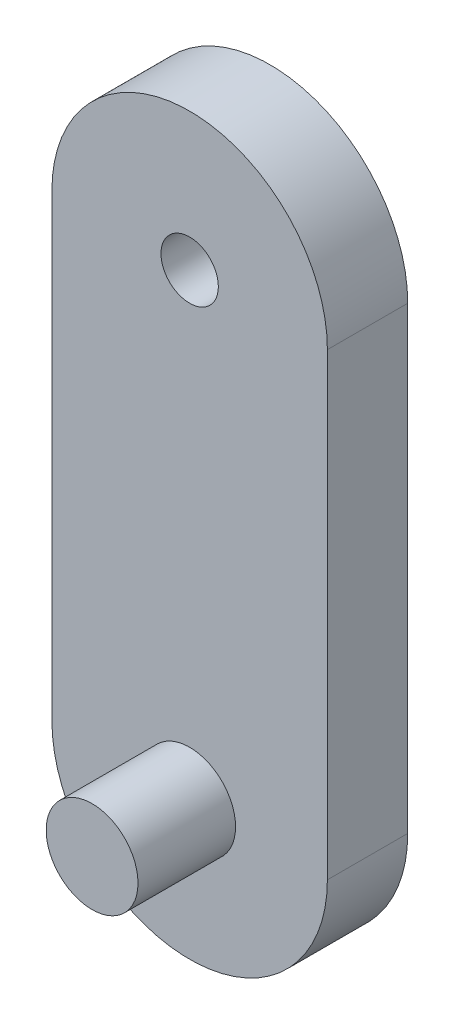
ISO-10303-21;
HEADER;
FILE_DESCRIPTION(('STEP AP214'),'2;1');
FILE_NAME('part.step','',(''),(''),'','','');
FILE_SCHEMA(('AUTOMOTIVE_DESIGN { 1 0 10303 214 1 1 1 1 }'));
ENDSEC;
DATA;
#1=APPLICATION_CONTEXT('core data for automotive mechanical design processes');
#2=APPLICATION_PROTOCOL_DEFINITION('international standard','automotive_design',2000,#1);
#3=PRODUCT_CONTEXT('',#1,'mechanical');
#4=PRODUCT('Part','Part','',(#3));
#5=PRODUCT_RELATED_PRODUCT_CATEGORY('part','',(#4));
#6=PRODUCT_DEFINITION_FORMATION('','',#4);
#7=PRODUCT_DEFINITION_CONTEXT('part definition',#1,'design');
#8=PRODUCT_DEFINITION('design','',#6,#7);
#9=PRODUCT_DEFINITION_SHAPE('','',#8);
#10=(LENGTH_UNIT() NAMED_UNIT(*) SI_UNIT(.MILLI.,.METRE.));
#11=(NAMED_UNIT(*) PLANE_ANGLE_UNIT() SI_UNIT($,.RADIAN.));
#12=(NAMED_UNIT(*) SI_UNIT($,.STERADIAN.) SOLID_ANGLE_UNIT());
#13=UNCERTAINTY_MEASURE_WITH_UNIT(LENGTH_MEASURE(1.E-05),#10,'distance_accuracy_value','');
#14=(GEOMETRIC_REPRESENTATION_CONTEXT(3) GLOBAL_UNCERTAINTY_ASSIGNED_CONTEXT((#13)) GLOBAL_UNIT_ASSIGNED_CONTEXT((#10,
#11,#12)) REPRESENTATION_CONTEXT('',''));
#15=CARTESIAN_POINT('',(0.,0.,0.));
#16=DIRECTION('',(0.,0.,1.));
#17=DIRECTION('',(1.,0.,0.));
#18=AXIS2_PLACEMENT_3D('',#15,#16,#17);
#19=CARTESIAN_POINT('',(-12.,0.,7.));
#20=DIRECTION('',(0.,0.,-1.));
#21=DIRECTION('',(-1.,0.,0.));
#22=AXIS2_PLACEMENT_3D('',#19,#20,#21);
#23=CYLINDRICAL_SURFACE('',#22,12.);
#24=CARTESIAN_POINT('',(-12.,0.,0.));
#25=DIRECTION('',(0.,0.,1.));
#26=DIRECTION('',(1.,0.,0.));
#27=AXIS2_PLACEMENT_3D('',#24,#25,#26);
#28=CIRCLE('',#27,12.);
#29=CARTESIAN_POINT('',(-24.,0.,0.));
#30=VERTEX_POINT('',#29);
#31=CARTESIAN_POINT('',(0.,0.,0.));
#32=VERTEX_POINT('',#31);
#33=EDGE_CURVE('E102',#30,#32,#28,.T.);
#34=ORIENTED_EDGE('',*,*,#33,.T.);
#35=DIRECTION('',(0.,0.,-1.));
#36=VECTOR('',#35,1.);
#37=CARTESIAN_POINT('',(0.,0.,7.));
#38=LINE('',#37,#36);
#39=CARTESIAN_POINT('',(0.,0.,7.));
#40=VERTEX_POINT('',#39);
#41=EDGE_CURVE('E11',#40,#32,#38,.T.);
#42=ORIENTED_EDGE('',*,*,#41,.F.);
#43=CARTESIAN_POINT('',(-12.,0.,7.));
#44=DIRECTION('',(0.,0.,1.));
#45=DIRECTION('',(1.,0.,0.));
#46=AXIS2_PLACEMENT_3D('',#43,#44,#45);
#47=CIRCLE('',#46,12.);
#48=CARTESIAN_POINT('',(-24.,0.,7.));
#49=VERTEX_POINT('',#48);
#50=EDGE_CURVE('E89',#49,#40,#47,.T.);
#51=ORIENTED_EDGE('',*,*,#50,.F.);
#52=DIRECTION('',(0.,0.,-1.));
#53=VECTOR('',#52,1.);
#54=CARTESIAN_POINT('',(-24.,0.,7.));
#55=LINE('',#54,#53);
#56=EDGE_CURVE('E98',#49,#30,#55,.T.);
#57=ORIENTED_EDGE('',*,*,#56,.T.);
#58=EDGE_LOOP('',(#34,#42,#51,#57));
#59=FACE_BOUND('',#58,.T.);
#60=ADVANCED_FACE('F37',(#59),#23,.T.);
#61=CARTESIAN_POINT('',(0.,0.,7.));
#62=DIRECTION('',(-1.,0.,0.));
#63=DIRECTION('',(0.,0.,1.));
#64=AXIS2_PLACEMENT_3D('',#61,#62,#63);
#65=PLANE('',#64);
#66=DIRECTION('',(0.,1.,0.));
#67=VECTOR('',#66,1.);
#68=CARTESIAN_POINT('',(0.,0.,0.));
#69=LINE('',#68,#67);
#70=CARTESIAN_POINT('',(0.,40.,0.));
#71=VERTEX_POINT('',#70);
#72=EDGE_CURVE('E93',#32,#71,#69,.T.);
#73=ORIENTED_EDGE('',*,*,#72,.T.);
#74=DIRECTION('',(0.,0.,-1.));
#75=VECTOR('',#74,1.);
#76=CARTESIAN_POINT('',(0.,40.,7.));
#77=LINE('',#76,#75);
#78=CARTESIAN_POINT('',(0.,40.,7.));
#79=VERTEX_POINT('',#78);
#80=EDGE_CURVE('E46',#79,#71,#77,.T.);
#81=ORIENTED_EDGE('',*,*,#80,.F.);
#82=DIRECTION('',(0.,1.,0.));
#83=VECTOR('',#82,1.);
#84=CARTESIAN_POINT('',(0.,0.,7.));
#85=LINE('',#84,#83);
#86=EDGE_CURVE('E84',#40,#79,#85,.T.);
#87=ORIENTED_EDGE('',*,*,#86,.F.);
#88=ORIENTED_EDGE('',*,*,#41,.T.);
#89=EDGE_LOOP('',(#73,#81,#87,#88));
#90=FACE_BOUND('',#89,.T.);
#91=ADVANCED_FACE('F92',(#90),#65,.F.);
#92=CARTESIAN_POINT('',(-12.,40.,7.));
#93=DIRECTION('',(0.,0.,-1.));
#94=DIRECTION('',(-1.,0.,0.));
#95=AXIS2_PLACEMENT_3D('',#92,#93,#94);
#96=CYLINDRICAL_SURFACE('',#95,12.);
#97=CARTESIAN_POINT('',(-12.,40.,0.));
#98=DIRECTION('',(0.,0.,1.));
#99=DIRECTION('',(-1.,0.,0.));
#100=AXIS2_PLACEMENT_3D('',#97,#98,#99);
#101=CIRCLE('',#100,12.);
#102=CARTESIAN_POINT('',(-24.,40.,0.));
#103=VERTEX_POINT('',#102);
#104=EDGE_CURVE('E71',#71,#103,#101,.T.);
#105=ORIENTED_EDGE('',*,*,#104,.T.);
#106=DIRECTION('',(0.,0.,-1.));
#107=VECTOR('',#106,1.);
#108=CARTESIAN_POINT('',(-24.,40.,7.));
#109=LINE('',#108,#107);
#110=CARTESIAN_POINT('',(-24.,40.,7.));
#111=VERTEX_POINT('',#110);
#112=EDGE_CURVE('E94',#111,#103,#109,.T.);
#113=ORIENTED_EDGE('',*,*,#112,.F.);
#114=CARTESIAN_POINT('',(-12.,40.,7.));
#115=DIRECTION('',(0.,0.,1.));
#116=DIRECTION('',(-1.,0.,0.));
#117=AXIS2_PLACEMENT_3D('',#114,#115,#116);
#118=CIRCLE('',#117,12.);
#119=EDGE_CURVE('E87',#79,#111,#118,.T.);
#120=ORIENTED_EDGE('',*,*,#119,.F.);
#121=ORIENTED_EDGE('',*,*,#80,.T.);
#122=EDGE_LOOP('',(#105,#113,#120,#121));
#123=FACE_BOUND('',#122,.T.);
#124=ADVANCED_FACE('F96',(#123),#96,.T.);
#125=CARTESIAN_POINT('',(-24.,0.,7.));
#126=DIRECTION('',(1.,0.,0.));
#127=DIRECTION('',(0.,0.,-1.));
#128=AXIS2_PLACEMENT_3D('',#125,#126,#127);
#129=PLANE('',#128);
#130=DIRECTION('',(0.,-1.,0.));
#131=VECTOR('',#130,1.);
#132=CARTESIAN_POINT('',(-24.,0.,0.));
#133=LINE('',#132,#131);
#134=EDGE_CURVE('E77',#103,#30,#133,.T.);
#135=ORIENTED_EDGE('',*,*,#134,.T.);
#136=ORIENTED_EDGE('',*,*,#56,.F.);
#137=DIRECTION('',(0.,-1.,0.));
#138=VECTOR('',#137,1.);
#139=CARTESIAN_POINT('',(-24.,0.,7.));
#140=LINE('',#139,#138);
#141=EDGE_CURVE('E54',#111,#49,#140,.T.);
#142=ORIENTED_EDGE('',*,*,#141,.F.);
#143=ORIENTED_EDGE('',*,*,#112,.T.);
#144=EDGE_LOOP('',(#135,#136,#142,#143));
#145=FACE_BOUND('',#144,.T.);
#146=ADVANCED_FACE('F110',(#145),#129,.F.);
#147=CARTESIAN_POINT('',(-12.,0.,7.));
#148=DIRECTION('',(0.,0.,1.));
#149=DIRECTION('',(1.,0.,0.));
#150=AXIS2_PLACEMENT_3D('',#147,#148,#149);
#151=PLANE('',#150);
#152=CARTESIAN_POINT('',(-12.,40.,7.));
#153=DIRECTION('',(0.,0.,1.));
#154=DIRECTION('',(1.,0.,0.));
#155=AXIS2_PLACEMENT_3D('',#152,#153,#154);
#156=CIRCLE('',#155,2.5);
#157=CARTESIAN_POINT('',(-9.5,40.,7.));
#158=VERTEX_POINT('',#157);
#159=EDGE_CURVE('E121',#158,#158,#156,.T.);
#160=ORIENTED_EDGE('',*,*,#159,.F.);
#161=EDGE_LOOP('',(#160));
#162=FACE_BOUND('',#161,.T.);
#163=CARTESIAN_POINT('',(-12.,0.,7.));
#164=DIRECTION('',(0.,0.,1.));
#165=DIRECTION('',(1.,0.,0.));
#166=AXIS2_PLACEMENT_3D('',#163,#164,#165);
#167=CIRCLE('',#166,4.);
#168=CARTESIAN_POINT('',(-8.,0.,7.));
#169=VERTEX_POINT('',#168);
#170=EDGE_CURVE('E116',#169,#169,#167,.T.);
#171=ORIENTED_EDGE('',*,*,#170,.F.);
#172=EDGE_LOOP('',(#171));
#173=FACE_BOUND('',#172,.T.);
#174=ORIENTED_EDGE('',*,*,#50,.T.);
#175=ORIENTED_EDGE('',*,*,#86,.T.);
#176=ORIENTED_EDGE('',*,*,#119,.T.);
#177=ORIENTED_EDGE('',*,*,#141,.T.);
#178=EDGE_LOOP('',(#174,#175,#176,#177));
#179=FACE_BOUND('',#178,.T.);
#180=ADVANCED_FACE('F85',(#162,#173,#179),#151,.T.);
#181=CARTESIAN_POINT('',(-12.,0.,0.));
#182=DIRECTION('',(0.,0.,1.));
#183=DIRECTION('',(1.,0.,0.));
#184=AXIS2_PLACEMENT_3D('',#181,#182,#183);
#185=PLANE('',#184);
#186=CARTESIAN_POINT('',(-12.,40.,0.));
#187=DIRECTION('',(0.,0.,1.));
#188=DIRECTION('',(1.,0.,0.));
#189=AXIS2_PLACEMENT_3D('',#186,#187,#188);
#190=CIRCLE('',#189,2.5);
#191=CARTESIAN_POINT('',(-9.5,40.,0.));
#192=VERTEX_POINT('',#191);
#193=EDGE_CURVE('E40',#192,#192,#190,.T.);
#194=ORIENTED_EDGE('',*,*,#193,.T.);
#195=EDGE_LOOP('',(#194));
#196=FACE_BOUND('',#195,.T.);
#197=ORIENTED_EDGE('',*,*,#33,.F.);
#198=ORIENTED_EDGE('',*,*,#134,.F.);
#199=ORIENTED_EDGE('',*,*,#104,.F.);
#200=ORIENTED_EDGE('',*,*,#72,.F.);
#201=EDGE_LOOP('',(#197,#198,#199,#200));
#202=FACE_BOUND('',#201,.T.);
#203=ADVANCED_FACE('F113',(#196,#202),#185,.F.);
#204=CARTESIAN_POINT('',(-12.,0.,15.5));
#205=DIRECTION('',(0.,0.,-1.));
#206=DIRECTION('',(-1.,0.,0.));
#207=AXIS2_PLACEMENT_3D('',#204,#205,#206);
#208=CYLINDRICAL_SURFACE('',#207,4.);
#209=CARTESIAN_POINT('',(-12.,0.,15.5));
#210=DIRECTION('',(0.,0.,1.));
#211=DIRECTION('',(1.,0.,0.));
#212=AXIS2_PLACEMENT_3D('',#209,#210,#211);
#213=CIRCLE('',#212,4.);
#214=CARTESIAN_POINT('',(-8.,0.,15.5));
#215=VERTEX_POINT('',#214);
#216=EDGE_CURVE('E105',#215,#215,#213,.T.);
#217=ORIENTED_EDGE('',*,*,#216,.F.);
#218=EDGE_LOOP('',(#217));
#219=FACE_BOUND('',#218,.T.);
#220=ORIENTED_EDGE('',*,*,#170,.T.);
#221=EDGE_LOOP('',(#220));
#222=FACE_BOUND('',#221,.T.);
#223=ADVANCED_FACE('F136',(#219,#222),#208,.T.);
#224=CARTESIAN_POINT('',(-12.,0.,15.5));
#225=DIRECTION('',(0.,0.,1.));
#226=DIRECTION('',(1.,0.,0.));
#227=AXIS2_PLACEMENT_3D('',#224,#225,#226);
#228=PLANE('',#227);
#229=ORIENTED_EDGE('',*,*,#216,.T.);
#230=EDGE_LOOP('',(#229));
#231=FACE_BOUND('',#230,.T.);
#232=ADVANCED_FACE('F131',(#231),#228,.T.);
#233=CARTESIAN_POINT('',(-12.,40.,-3.5));
#234=DIRECTION('',(0.,0.,1.));
#235=DIRECTION('',(1.,0.,0.));
#236=AXIS2_PLACEMENT_3D('',#233,#234,#235);
#237=CYLINDRICAL_SURFACE('',#236,2.5);
#238=CARTESIAN_POINT('',(-9.5,40.,7.));
#239=CARTESIAN_POINT('',(-9.5,40.,6.92708333333333));
#240=CARTESIAN_POINT('',(-9.5,40.,6.85416666666667));
#241=CARTESIAN_POINT('',(-9.5,40.,6.70833333333333));
#242=CARTESIAN_POINT('',(-9.5,40.,6.63541666666667));
#243=CARTESIAN_POINT('',(-9.5,40.,6.48958333333333));
#244=CARTESIAN_POINT('',(-9.5,40.,6.41666666666667));
#245=CARTESIAN_POINT('',(-9.5,40.,6.27083333333333));
#246=CARTESIAN_POINT('',(-9.5,40.,6.19791666666667));
#247=CARTESIAN_POINT('',(-9.5,40.,6.05208333333333));
#248=CARTESIAN_POINT('',(-9.5,40.,5.97916666666667));
#249=CARTESIAN_POINT('',(-9.5,40.,5.83333333333333));
#250=CARTESIAN_POINT('',(-9.5,40.,5.76041666666667));
#251=CARTESIAN_POINT('',(-9.5,40.,5.61458333333333));
#252=CARTESIAN_POINT('',(-9.5,40.,5.54166666666667));
#253=CARTESIAN_POINT('',(-9.5,40.,5.39583333333333));
#254=CARTESIAN_POINT('',(-9.5,40.,5.32291666666667));
#255=CARTESIAN_POINT('',(-9.5,40.,5.17708333333333));
#256=CARTESIAN_POINT('',(-9.5,40.,5.10416666666667));
#257=CARTESIAN_POINT('',(-9.5,40.,4.95833333333333));
#258=CARTESIAN_POINT('',(-9.5,40.,4.88541666666667));
#259=CARTESIAN_POINT('',(-9.5,40.,4.73958333333333));
#260=CARTESIAN_POINT('',(-9.5,40.,4.66666666666667));
#261=CARTESIAN_POINT('',(-9.5,40.,4.52083333333333));
#262=CARTESIAN_POINT('',(-9.5,40.,4.44791666666667));
#263=CARTESIAN_POINT('',(-9.5,40.,4.30208333333333));
#264=CARTESIAN_POINT('',(-9.5,40.,4.22916666666667));
#265=CARTESIAN_POINT('',(-9.5,40.,4.08333333333333));
#266=CARTESIAN_POINT('',(-9.5,40.,4.01041666666667));
#267=CARTESIAN_POINT('',(-9.5,40.,3.86458333333333));
#268=CARTESIAN_POINT('',(-9.5,40.,3.79166666666667));
#269=CARTESIAN_POINT('',(-9.5,40.,3.64583333333333));
#270=CARTESIAN_POINT('',(-9.5,40.,3.57291666666667));
#271=CARTESIAN_POINT('',(-9.5,40.,3.42708333333333));
#272=CARTESIAN_POINT('',(-9.5,40.,3.35416666666667));
#273=CARTESIAN_POINT('',(-9.5,40.,3.20833333333333));
#274=CARTESIAN_POINT('',(-9.5,40.,3.13541666666667));
#275=CARTESIAN_POINT('',(-9.5,40.,2.98958333333333));
#276=CARTESIAN_POINT('',(-9.5,40.,2.91666666666667));
#277=CARTESIAN_POINT('',(-9.5,40.,2.77083333333333));
#278=CARTESIAN_POINT('',(-9.5,40.,2.69791666666667));
#279=CARTESIAN_POINT('',(-9.5,40.,2.55208333333333));
#280=CARTESIAN_POINT('',(-9.5,40.,2.47916666666667));
#281=CARTESIAN_POINT('',(-9.5,40.,2.33333333333333));
#282=CARTESIAN_POINT('',(-9.5,40.,2.26041666666667));
#283=CARTESIAN_POINT('',(-9.5,40.,2.11458333333333));
#284=CARTESIAN_POINT('',(-9.5,40.,2.04166666666667));
#285=CARTESIAN_POINT('',(-9.5,40.,1.89583333333333));
#286=CARTESIAN_POINT('',(-9.5,40.,1.82291666666667));
#287=CARTESIAN_POINT('',(-9.5,40.,1.67708333333333));
#288=CARTESIAN_POINT('',(-9.5,40.,1.60416666666667));
#289=CARTESIAN_POINT('',(-9.5,40.,1.45833333333333));
#290=CARTESIAN_POINT('',(-9.5,40.,1.38541666666667));
#291=CARTESIAN_POINT('',(-9.5,40.,1.23958333333333));
#292=CARTESIAN_POINT('',(-9.5,40.,1.16666666666667));
#293=CARTESIAN_POINT('',(-9.5,40.,1.02083333333333));
#294=CARTESIAN_POINT('',(-9.5,40.,0.947916666666666));
#295=CARTESIAN_POINT('',(-9.5,40.,0.802083333333333));
#296=CARTESIAN_POINT('',(-9.5,40.,0.729166666666666));
#297=CARTESIAN_POINT('',(-9.5,40.,0.583333333333333));
#298=CARTESIAN_POINT('',(-9.5,40.,0.510416666666666));
#299=CARTESIAN_POINT('',(-9.5,40.,0.364583333333333));
#300=CARTESIAN_POINT('',(-9.5,40.,0.291666666666666));
#301=CARTESIAN_POINT('',(-9.5,40.,0.145833333333333));
#302=CARTESIAN_POINT('',(-9.5,40.,0.0729166666666662));
#303=CARTESIAN_POINT('',(-9.5,40.,0.));
#304=B_SPLINE_CURVE_WITH_KNOTS('',3,(#238,#239,#240,#241,#242,#243,#244,#245,#246,#247,#248,
#249,#250,#251,#252,#253,#254,#255,#256,#257,#258,#259,#260,#261,#262,#263,#264,#265,#266,#267,
#268,#269,#270,#271,#272,#273,#274,#275,#276,#277,#278,#279,#280,#281,#282,#283,#284,#285,#286,
#287,#288,#289,#290,#291,#292,#293,#294,#295,#296,#297,#298,#299,#300,#301,#302,#303),
.UNSPECIFIED.,.F.,.F.,(4,2,2,2,2,2,2,2,2,2,2,2,2,2,2,2,2,2,2,2,2,2,2,2,2,2,2,2,2,2,2,2,4),(0.,
0.21875,0.4375,0.656250000000001,0.875000000000001,1.09375,1.3125,1.53125,1.75,1.96875,2.1875,
2.40625,2.625,2.84375,3.0625,3.28125,3.5,3.71875,3.9375,4.15625,4.375,4.59375,4.8125,5.03125,
5.25,5.46875,5.6875,5.90625,6.125,6.34375,6.5625,6.78125,7.),.UNSPECIFIED.);
#305=EDGE_CURVE('BSEAM129',#158,#192,#304,.T.);
#306=ORIENTED_EDGE('',*,*,#159,.T.);
#307=ORIENTED_EDGE('',*,*,#193,.F.);
#308=ORIENTED_EDGE('',*,*,#305,.T.);
#309=ORIENTED_EDGE('',*,*,#305,.F.);
#310=EDGE_LOOP('',(#306,#308,#307,#309));
#311=FACE_BOUND('',#310,.T.);
#312=ADVANCED_FACE('F129',(#311),#237,.F.);
#313=CLOSED_SHELL('',(#60,#91,#124,#146,#180,#203,#223,#232,#312));
#314=MANIFOLD_SOLID_BREP('B2',#313);
#315=ADVANCED_BREP_SHAPE_REPRESENTATION('',(#18,#314),#14);
#316=SHAPE_DEFINITION_REPRESENTATION(#9,#315);
ENDSEC;
END-ISO-10303-21;
